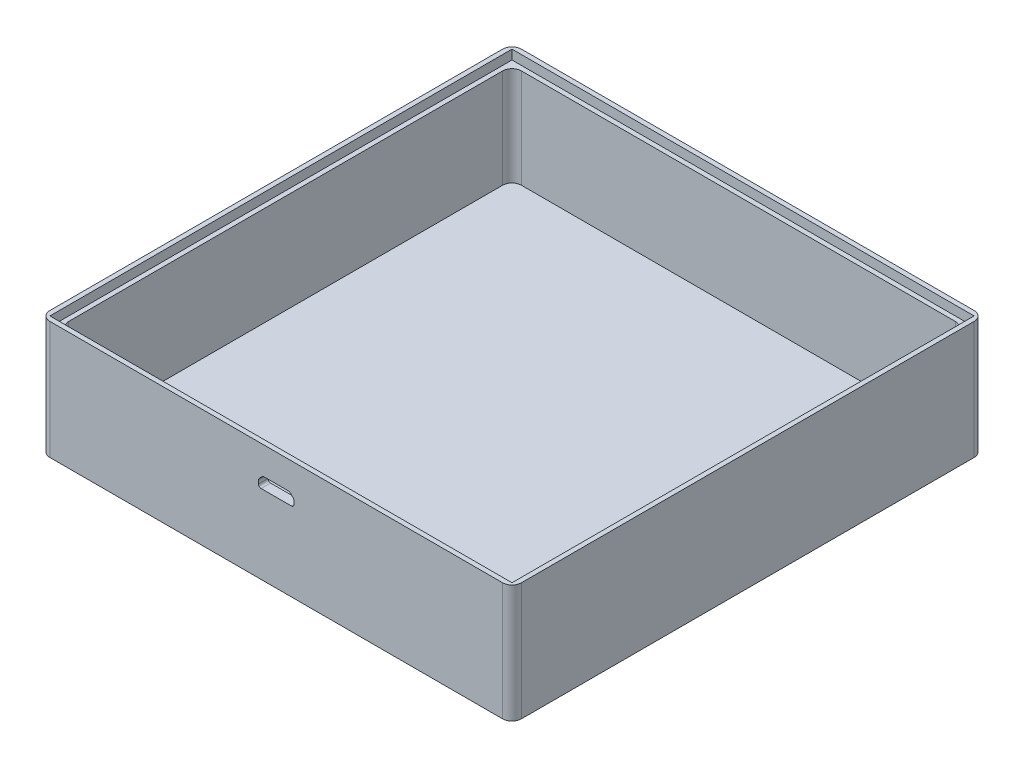
ISO-10303-21;
HEADER;
FILE_DESCRIPTION(('STEP AP214'),'2;1');
FILE_NAME('part.step','',(''),(''),'','','');
FILE_SCHEMA(('AUTOMOTIVE_DESIGN { 1 0 10303 214 1 1 1 1 }'));
ENDSEC;
DATA;
#1=APPLICATION_CONTEXT('core data for automotive mechanical design processes');
#2=APPLICATION_PROTOCOL_DEFINITION('international standard','automotive_design',2000,#1);
#3=PRODUCT_CONTEXT('',#1,'mechanical');
#4=PRODUCT('Part','Part','',(#3));
#5=PRODUCT_RELATED_PRODUCT_CATEGORY('part','',(#4));
#6=PRODUCT_DEFINITION_FORMATION('','',#4);
#7=PRODUCT_DEFINITION_CONTEXT('part definition',#1,'design');
#8=PRODUCT_DEFINITION('design','',#6,#7);
#9=PRODUCT_DEFINITION_SHAPE('','',#8);
#10=(LENGTH_UNIT() NAMED_UNIT(*) SI_UNIT(.MILLI.,.METRE.));
#11=(NAMED_UNIT(*) PLANE_ANGLE_UNIT() SI_UNIT($,.RADIAN.));
#12=(NAMED_UNIT(*) SI_UNIT($,.STERADIAN.) SOLID_ANGLE_UNIT());
#13=UNCERTAINTY_MEASURE_WITH_UNIT(LENGTH_MEASURE(1.E-05),#10,'distance_accuracy_value','');
#14=(GEOMETRIC_REPRESENTATION_CONTEXT(3) GLOBAL_UNCERTAINTY_ASSIGNED_CONTEXT((#13)) GLOBAL_UNIT_ASSIGNED_CONTEXT((#10,
#11,#12)) REPRESENTATION_CONTEXT('',''));
#15=CARTESIAN_POINT('',(0.,0.,0.));
#16=DIRECTION('',(0.,0.,1.));
#17=DIRECTION('',(1.,0.,0.));
#18=AXIS2_PLACEMENT_3D('',#15,#16,#17);
#19=CARTESIAN_POINT('',(0.,25.,50.));
#20=DIRECTION('',(0.,0.,-1.));
#21=DIRECTION('',(-1.,0.,0.));
#22=AXIS2_PLACEMENT_3D('',#19,#20,#21);
#23=PLANE('',#22);
#24=DIRECTION('',(0.,1.,0.));
#25=VECTOR('',#24,1.);
#26=CARTESIAN_POINT('',(3.75,0.,50.));
#27=LINE('',#26,#25);
#28=CARTESIAN_POINT('',(3.75,17.2550000000001,50.));
#29=VERTEX_POINT('',#28);
#30=CARTESIAN_POINT('',(3.75,18.001446611338,50.));
#31=VERTEX_POINT('',#30);
#32=EDGE_CURVE('E320',#29,#31,#27,.T.);
#33=ORIENTED_EDGE('',*,*,#32,.F.);
#34=CARTESIAN_POINT('',(3.20000000000001,17.255,50.));
#35=DIRECTION('',(0.,0.,1.));
#36=DIRECTION('',(1.,0.,0.));
#37=AXIS2_PLACEMENT_3D('',#34,#35,#36);
#38=CIRCLE('',#37,0.549999999999995);
#39=CARTESIAN_POINT('',(3.20000000000001,16.705,50.));
#40=VERTEX_POINT('',#39);
#41=EDGE_CURVE('E316',#29,#40,#38,.F.);
#42=ORIENTED_EDGE('',*,*,#41,.T.);
#43=DIRECTION('',(-1.,0.,0.));
#44=VECTOR('',#43,1.);
#45=CARTESIAN_POINT('',(0.,16.705,50.));
#46=LINE('',#45,#44);
#47=CARTESIAN_POINT('',(-3.20000000000001,16.705,50.));
#48=VERTEX_POINT('',#47);
#49=EDGE_CURVE('E355',#40,#48,#46,.T.);
#50=ORIENTED_EDGE('',*,*,#49,.T.);
#51=CARTESIAN_POINT('',(-3.20000000000001,17.255,50.));
#52=DIRECTION('',(0.,0.,1.));
#53=DIRECTION('',(1.,0.,0.));
#54=AXIS2_PLACEMENT_3D('',#51,#52,#53);
#55=CIRCLE('',#54,0.549999999999995);
#56=CARTESIAN_POINT('',(-3.75,17.2550000000001,50.));
#57=VERTEX_POINT('',#56);
#58=EDGE_CURVE('E351',#57,#48,#55,.T.);
#59=ORIENTED_EDGE('',*,*,#58,.F.);
#60=DIRECTION('',(0.,1.,0.));
#61=VECTOR('',#60,1.);
#62=CARTESIAN_POINT('',(-3.75,0.,50.));
#63=LINE('',#62,#61);
#64=CARTESIAN_POINT('',(-3.75,18.001446611338,50.));
#65=VERTEX_POINT('',#64);
#66=EDGE_CURVE('E347',#57,#65,#63,.T.);
#67=ORIENTED_EDGE('',*,*,#66,.T.);
#68=CARTESIAN_POINT('',(-3.2000000046621,18.001446611338,50.));
#69=DIRECTION('',(0.,0.,1.));
#70=DIRECTION('',(1.,0.,0.));
#71=AXIS2_PLACEMENT_3D('',#68,#69,#70);
#72=CIRCLE('',#71,0.549999995337901);
#73=CARTESIAN_POINT('',(-3.5889087296526,18.3903553390594,50.));
#74=VERTEX_POINT('',#73);
#75=EDGE_CURVE('E344',#74,#65,#72,.T.);
#76=ORIENTED_EDGE('',*,*,#75,.F.);
#77=DIRECTION('',(0.707106781186547,0.707106781186548,0.));
#78=VECTOR('',#77,1.);
#79=CARTESIAN_POINT('',(-10.989632034356,10.989632034356,50.));
#80=LINE('',#79,#78);
#81=CARTESIAN_POINT('',(-2.9853553390594,18.9939087296527,50.));
#82=VERTEX_POINT('',#81);
#83=EDGE_CURVE('E340',#74,#82,#80,.T.);
#84=ORIENTED_EDGE('',*,*,#83,.T.);
#85=CARTESIAN_POINT('',(-2.5964466094068,18.6050000000001,50.));
#86=DIRECTION('',(0.,0.,1.));
#87=DIRECTION('',(1.,0.,0.));
#88=AXIS2_PLACEMENT_3D('',#85,#86,#87);
#89=CIRCLE('',#88,0.549999999999997);
#90=CARTESIAN_POINT('',(-2.5964466094068,19.1550000000001,50.));
#91=VERTEX_POINT('',#90);
#92=EDGE_CURVE('E337',#91,#82,#89,.T.);
#93=ORIENTED_EDGE('',*,*,#92,.F.);
#94=DIRECTION('',(-1.,0.,0.));
#95=VECTOR('',#94,1.);
#96=CARTESIAN_POINT('',(0.,19.1550000000001,50.));
#97=LINE('',#96,#95);
#98=CARTESIAN_POINT('',(2.5964466094068,19.1550000000001,50.));
#99=VERTEX_POINT('',#98);
#100=EDGE_CURVE('E334',#99,#91,#97,.T.);
#101=ORIENTED_EDGE('',*,*,#100,.F.);
#102=CARTESIAN_POINT('',(2.5964466094068,18.6050000000001,50.));
#103=DIRECTION('',(0.,0.,1.));
#104=DIRECTION('',(1.,0.,0.));
#105=AXIS2_PLACEMENT_3D('',#102,#103,#104);
#106=CIRCLE('',#105,0.549999999999998);
#107=CARTESIAN_POINT('',(2.9853553390594,18.9939087296527,50.));
#108=VERTEX_POINT('',#107);
#109=EDGE_CURVE('E330',#99,#108,#106,.F.);
#110=ORIENTED_EDGE('',*,*,#109,.T.);
#111=DIRECTION('',(-0.707106781186547,0.707106781186548,0.));
#112=VECTOR('',#111,1.);
#113=CARTESIAN_POINT('',(10.989632034356,10.989632034356,50.));
#114=LINE('',#113,#112);
#115=CARTESIAN_POINT('',(3.5889087296526,18.3903553390594,50.));
#116=VERTEX_POINT('',#115);
#117=EDGE_CURVE('E327',#116,#108,#114,.T.);
#118=ORIENTED_EDGE('',*,*,#117,.F.);
#119=CARTESIAN_POINT('',(3.2000000046621,18.001446611338,50.));
#120=DIRECTION('',(0.,0.,1.));
#121=DIRECTION('',(1.,0.,0.));
#122=AXIS2_PLACEMENT_3D('',#119,#120,#121);
#123=CIRCLE('',#122,0.549999995337902);
#124=EDGE_CURVE('E323',#116,#31,#123,.F.);
#125=ORIENTED_EDGE('',*,*,#124,.T.);
#126=EDGE_LOOP('',(#33,#42,#50,#59,#67,#76,#84,#93,#101,#110,#118,#125));
#127=FACE_BOUND('',#126,.T.);
#128=DIRECTION('',(1.,0.,0.));
#129=VECTOR('',#128,1.);
#130=CARTESIAN_POINT('',(-50.,25.,50.));
#131=LINE('',#130,#129);
#132=CARTESIAN_POINT('',(-48.,25.,50.));
#133=VERTEX_POINT('',#132);
#134=CARTESIAN_POINT('',(48.,25.,50.));
#135=VERTEX_POINT('',#134);
#136=EDGE_CURVE('E423',#133,#135,#131,.T.);
#137=ORIENTED_EDGE('',*,*,#136,.F.);
#138=DIRECTION('',(0.,-1.,0.));
#139=VECTOR('',#138,1.);
#140=CARTESIAN_POINT('',(-48.,25.,50.));
#141=LINE('',#140,#139);
#142=CARTESIAN_POINT('',(-48.,0.,50.));
#143=VERTEX_POINT('',#142);
#144=EDGE_CURVE('E503',#133,#143,#141,.T.);
#145=ORIENTED_EDGE('',*,*,#144,.T.);
#146=DIRECTION('',(1.,0.,0.));
#147=VECTOR('',#146,1.);
#148=CARTESIAN_POINT('',(0.,0.,50.));
#149=LINE('',#148,#147);
#150=CARTESIAN_POINT('',(48.,0.,50.));
#151=VERTEX_POINT('',#150);
#152=EDGE_CURVE('E422',#143,#151,#149,.T.);
#153=ORIENTED_EDGE('',*,*,#152,.T.);
#154=DIRECTION('',(0.,-1.,0.));
#155=VECTOR('',#154,1.);
#156=CARTESIAN_POINT('',(48.,25.,50.));
#157=LINE('',#156,#155);
#158=EDGE_CURVE('E500',#151,#135,#157,.F.);
#159=ORIENTED_EDGE('',*,*,#158,.T.);
#160=EDGE_LOOP('',(#137,#145,#153,#159));
#161=FACE_BOUND('',#160,.T.);
#162=ADVANCED_FACE('F41',(#127,#161),#23,.F.);
#163=CARTESIAN_POINT('',(50.,25.,50.));
#164=DIRECTION('',(-1.,0.,0.));
#165=DIRECTION('',(0.,0.,1.));
#166=AXIS2_PLACEMENT_3D('',#163,#164,#165);
#167=PLANE('',#166);
#168=DIRECTION('',(0.,0.,-1.));
#169=VECTOR('',#168,1.);
#170=CARTESIAN_POINT('',(50.,0.,50.));
#171=LINE('',#170,#169);
#172=CARTESIAN_POINT('',(50.,0.,48.));
#173=VERTEX_POINT('',#172);
#174=CARTESIAN_POINT('',(50.,0.,-48.));
#175=VERTEX_POINT('',#174);
#176=EDGE_CURVE('E444',#173,#175,#171,.T.);
#177=ORIENTED_EDGE('',*,*,#176,.T.);
#178=DIRECTION('',(0.,-1.,0.));
#179=VECTOR('',#178,1.);
#180=CARTESIAN_POINT('',(50.,25.,-48.));
#181=LINE('',#180,#179);
#182=CARTESIAN_POINT('',(50.,25.,-48.));
#183=VERTEX_POINT('',#182);
#184=EDGE_CURVE('E549',#175,#183,#181,.F.);
#185=ORIENTED_EDGE('',*,*,#184,.T.);
#186=DIRECTION('',(0.,0.,-1.));
#187=VECTOR('',#186,1.);
#188=CARTESIAN_POINT('',(50.,25.,50.));
#189=LINE('',#188,#187);
#190=CARTESIAN_POINT('',(50.,25.,48.));
#191=VERTEX_POINT('',#190);
#192=EDGE_CURVE('E427',#191,#183,#189,.T.);
#193=ORIENTED_EDGE('',*,*,#192,.F.);
#194=DIRECTION('',(0.,-1.,0.));
#195=VECTOR('',#194,1.);
#196=CARTESIAN_POINT('',(50.,25.,48.));
#197=LINE('',#196,#195);
#198=EDGE_CURVE('E545',#191,#173,#197,.T.);
#199=ORIENTED_EDGE('',*,*,#198,.T.);
#200=EDGE_LOOP('',(#177,#185,#193,#199));
#201=FACE_BOUND('',#200,.T.);
#202=ADVANCED_FACE('F639',(#201),#167,.F.);
#203=CARTESIAN_POINT('',(-50.,25.,-50.));
#204=DIRECTION('',(0.,0.,1.));
#205=DIRECTION('',(1.,0.,0.));
#206=AXIS2_PLACEMENT_3D('',#203,#204,#205);
#207=PLANE('',#206);
#208=DIRECTION('',(-1.,0.,0.));
#209=VECTOR('',#208,1.);
#210=CARTESIAN_POINT('',(-50.,0.,-50.));
#211=LINE('',#210,#209);
#212=CARTESIAN_POINT('',(48.,0.,-50.));
#213=VERTEX_POINT('',#212);
#214=CARTESIAN_POINT('',(-48.,0.,-50.));
#215=VERTEX_POINT('',#214);
#216=EDGE_CURVE('E448',#213,#215,#211,.T.);
#217=ORIENTED_EDGE('',*,*,#216,.T.);
#218=DIRECTION('',(0.,-1.,0.));
#219=VECTOR('',#218,1.);
#220=CARTESIAN_POINT('',(-48.,25.,-50.));
#221=LINE('',#220,#219);
#222=CARTESIAN_POINT('',(-48.,25.,-50.));
#223=VERTEX_POINT('',#222);
#224=EDGE_CURVE('E542',#215,#223,#221,.F.);
#225=ORIENTED_EDGE('',*,*,#224,.T.);
#226=DIRECTION('',(-1.,0.,0.));
#227=VECTOR('',#226,1.);
#228=CARTESIAN_POINT('',(-50.,25.,-50.));
#229=LINE('',#228,#227);
#230=CARTESIAN_POINT('',(48.,25.,-50.));
#231=VERTEX_POINT('',#230);
#232=EDGE_CURVE('E432',#231,#223,#229,.T.);
#233=ORIENTED_EDGE('',*,*,#232,.F.);
#234=DIRECTION('',(0.,-1.,0.));
#235=VECTOR('',#234,1.);
#236=CARTESIAN_POINT('',(48.,25.,-50.));
#237=LINE('',#236,#235);
#238=EDGE_CURVE('E538',#231,#213,#237,.T.);
#239=ORIENTED_EDGE('',*,*,#238,.T.);
#240=EDGE_LOOP('',(#217,#225,#233,#239));
#241=FACE_BOUND('',#240,.T.);
#242=ADVANCED_FACE('F645',(#241),#207,.F.);
#243=CARTESIAN_POINT('',(-50.,25.,-50.));
#244=DIRECTION('',(1.,0.,0.));
#245=DIRECTION('',(0.,0.,-1.));
#246=AXIS2_PLACEMENT_3D('',#243,#244,#245);
#247=PLANE('',#246);
#248=DIRECTION('',(0.,0.,1.));
#249=VECTOR('',#248,1.);
#250=CARTESIAN_POINT('',(-50.,0.,-50.));
#251=LINE('',#250,#249);
#252=CARTESIAN_POINT('',(-50.,0.,-48.));
#253=VERTEX_POINT('',#252);
#254=CARTESIAN_POINT('',(-50.,0.,48.));
#255=VERTEX_POINT('',#254);
#256=EDGE_CURVE('E428',#253,#255,#251,.T.);
#257=ORIENTED_EDGE('',*,*,#256,.T.);
#258=DIRECTION('',(0.,-1.,0.));
#259=VECTOR('',#258,1.);
#260=CARTESIAN_POINT('',(-50.,25.,48.));
#261=LINE('',#260,#259);
#262=CARTESIAN_POINT('',(-50.,25.,48.));
#263=VERTEX_POINT('',#262);
#264=EDGE_CURVE('E523',#255,#263,#261,.F.);
#265=ORIENTED_EDGE('',*,*,#264,.T.);
#266=DIRECTION('',(0.,0.,1.));
#267=VECTOR('',#266,1.);
#268=CARTESIAN_POINT('',(-50.,25.,-50.));
#269=LINE('',#268,#267);
#270=CARTESIAN_POINT('',(-50.,25.,-48.));
#271=VERTEX_POINT('',#270);
#272=EDGE_CURVE('E436',#271,#263,#269,.T.);
#273=ORIENTED_EDGE('',*,*,#272,.F.);
#274=DIRECTION('',(0.,-1.,0.));
#275=VECTOR('',#274,1.);
#276=CARTESIAN_POINT('',(-50.,25.,-48.));
#277=LINE('',#276,#275);
#278=EDGE_CURVE('E519',#271,#253,#277,.T.);
#279=ORIENTED_EDGE('',*,*,#278,.T.);
#280=EDGE_LOOP('',(#257,#265,#273,#279));
#281=FACE_BOUND('',#280,.T.);
#282=ADVANCED_FACE('F688',(#281),#247,.F.);
#283=CARTESIAN_POINT('',(0.,25.,0.));
#284=DIRECTION('',(0.,1.,0.));
#285=DIRECTION('',(0.,0.,1.));
#286=AXIS2_PLACEMENT_3D('',#283,#284,#285);
#287=PLANE('',#286);
#288=DIRECTION('',(1.,0.,0.));
#289=VECTOR('',#288,1.);
#290=CARTESIAN_POINT('',(49.,25.,49.));
#291=LINE('',#290,#289);
#292=CARTESIAN_POINT('',(-49.,25.,49.));
#293=VERTEX_POINT('',#292);
#294=CARTESIAN_POINT('',(49.,25.,49.));
#295=VERTEX_POINT('',#294);
#296=EDGE_CURVE('E258',#293,#295,#291,.T.);
#297=ORIENTED_EDGE('',*,*,#296,.F.);
#298=DIRECTION('',(0.,0.,1.));
#299=VECTOR('',#298,1.);
#300=CARTESIAN_POINT('',(-49.,25.,49.));
#301=LINE('',#300,#299);
#302=CARTESIAN_POINT('',(-49.,25.,-49.));
#303=VERTEX_POINT('',#302);
#304=EDGE_CURVE('E278',#303,#293,#301,.T.);
#305=ORIENTED_EDGE('',*,*,#304,.F.);
#306=DIRECTION('',(-1.,0.,0.));
#307=VECTOR('',#306,1.);
#308=CARTESIAN_POINT('',(-49.,25.,-49.));
#309=LINE('',#308,#307);
#310=CARTESIAN_POINT('',(49.,25.,-49.));
#311=VERTEX_POINT('',#310);
#312=EDGE_CURVE('E282',#311,#303,#309,.T.);
#313=ORIENTED_EDGE('',*,*,#312,.F.);
#314=DIRECTION('',(0.,0.,-1.));
#315=VECTOR('',#314,1.);
#316=CARTESIAN_POINT('',(49.,25.,-49.));
#317=LINE('',#316,#315);
#318=EDGE_CURVE('E291',#295,#311,#317,.T.);
#319=ORIENTED_EDGE('',*,*,#318,.F.);
#320=EDGE_LOOP('',(#297,#305,#313,#319));
#321=FACE_BOUND('',#320,.T.);
#322=ORIENTED_EDGE('',*,*,#272,.T.);
#323=CARTESIAN_POINT('',(-48.,25.,48.));
#324=DIRECTION('',(0.,1.,0.));
#325=DIRECTION('',(0.,0.,1.));
#326=AXIS2_PLACEMENT_3D('',#323,#324,#325);
#327=CIRCLE('',#326,2.);
#328=EDGE_CURVE('E535',#263,#133,#327,.T.);
#329=ORIENTED_EDGE('',*,*,#328,.T.);
#330=ORIENTED_EDGE('',*,*,#136,.T.);
#331=CARTESIAN_POINT('',(48.,25.,48.));
#332=DIRECTION('',(0.,1.,0.));
#333=DIRECTION('',(0.,0.,1.));
#334=AXIS2_PLACEMENT_3D('',#331,#332,#333);
#335=CIRCLE('',#334,2.);
#336=EDGE_CURVE('E526',#135,#191,#335,.T.);
#337=ORIENTED_EDGE('',*,*,#336,.T.);
#338=ORIENTED_EDGE('',*,*,#192,.T.);
#339=CARTESIAN_POINT('',(48.,25.,-48.));
#340=DIRECTION('',(0.,1.,0.));
#341=DIRECTION('',(0.,0.,1.));
#342=AXIS2_PLACEMENT_3D('',#339,#340,#341);
#343=CIRCLE('',#342,2.);
#344=EDGE_CURVE('E529',#183,#231,#343,.T.);
#345=ORIENTED_EDGE('',*,*,#344,.T.);
#346=ORIENTED_EDGE('',*,*,#232,.T.);
#347=CARTESIAN_POINT('',(-48.,25.,-48.));
#348=DIRECTION('',(0.,1.,0.));
#349=DIRECTION('',(0.,0.,1.));
#350=AXIS2_PLACEMENT_3D('',#347,#348,#349);
#351=CIRCLE('',#350,2.);
#352=EDGE_CURVE('E532',#223,#271,#351,.T.);
#353=ORIENTED_EDGE('',*,*,#352,.T.);
#354=EDGE_LOOP('',(#322,#329,#330,#337,#338,#345,#346,#353));
#355=FACE_BOUND('',#354,.T.);
#356=ADVANCED_FACE('F673',(#321,#355),#287,.T.);
#357=CARTESIAN_POINT('',(0.,0.,0.));
#358=DIRECTION('',(0.,1.,0.));
#359=DIRECTION('',(0.,0.,1.));
#360=AXIS2_PLACEMENT_3D('',#357,#358,#359);
#361=PLANE('',#360);
#362=ORIENTED_EDGE('',*,*,#152,.F.);
#363=CARTESIAN_POINT('',(-48.,0.,48.));
#364=DIRECTION('',(0.,1.,0.));
#365=DIRECTION('',(0.,0.,1.));
#366=AXIS2_PLACEMENT_3D('',#363,#364,#365);
#367=CIRCLE('',#366,2.);
#368=EDGE_CURVE('E516',#143,#255,#367,.F.);
#369=ORIENTED_EDGE('',*,*,#368,.T.);
#370=ORIENTED_EDGE('',*,*,#256,.F.);
#371=CARTESIAN_POINT('',(-48.,0.,-48.));
#372=DIRECTION('',(0.,1.,0.));
#373=DIRECTION('',(0.,0.,1.));
#374=AXIS2_PLACEMENT_3D('',#371,#372,#373);
#375=CIRCLE('',#374,2.);
#376=EDGE_CURVE('E513',#253,#215,#375,.F.);
#377=ORIENTED_EDGE('',*,*,#376,.T.);
#378=ORIENTED_EDGE('',*,*,#216,.F.);
#379=CARTESIAN_POINT('',(48.,0.,-48.));
#380=DIRECTION('',(0.,1.,0.));
#381=DIRECTION('',(0.,0.,1.));
#382=AXIS2_PLACEMENT_3D('',#379,#380,#381);
#383=CIRCLE('',#382,2.);
#384=EDGE_CURVE('E510',#213,#175,#383,.F.);
#385=ORIENTED_EDGE('',*,*,#384,.T.);
#386=ORIENTED_EDGE('',*,*,#176,.F.);
#387=CARTESIAN_POINT('',(48.,0.,48.));
#388=DIRECTION('',(0.,1.,0.));
#389=DIRECTION('',(0.,0.,1.));
#390=AXIS2_PLACEMENT_3D('',#387,#388,#389);
#391=CIRCLE('',#390,2.);
#392=EDGE_CURVE('E507',#173,#151,#391,.F.);
#393=ORIENTED_EDGE('',*,*,#392,.T.);
#394=EDGE_LOOP('',(#362,#369,#370,#377,#378,#385,#386,#393));
#395=FACE_BOUND('',#394,.T.);
#396=ADVANCED_FACE('F694',(#395),#361,.F.);
#397=CARTESIAN_POINT('',(0.,25.,48.));
#398=DIRECTION('',(0.,0.,-1.));
#399=DIRECTION('',(-1.,0.,0.));
#400=AXIS2_PLACEMENT_3D('',#397,#398,#399);
#401=PLANE('',#400);
#402=DIRECTION('',(-1.,0.,0.));
#403=VECTOR('',#402,1.);
#404=CARTESIAN_POINT('',(0.,23.,48.));
#405=LINE('',#404,#403);
#406=CARTESIAN_POINT('',(46.,23.,48.));
#407=VERTEX_POINT('',#406);
#408=CARTESIAN_POINT('',(-46.,23.,48.));
#409=VERTEX_POINT('',#408);
#410=EDGE_CURVE('E313',#407,#409,#405,.T.);
#411=ORIENTED_EDGE('',*,*,#410,.F.);
#412=DIRECTION('',(0.,-1.,0.));
#413=VECTOR('',#412,1.);
#414=CARTESIAN_POINT('',(46.,2.,48.));
#415=LINE('',#414,#413);
#416=CARTESIAN_POINT('',(46.,2.,48.));
#417=VERTEX_POINT('',#416);
#418=EDGE_CURVE('E555',#407,#417,#415,.T.);
#419=ORIENTED_EDGE('',*,*,#418,.T.);
#420=DIRECTION('',(1.,0.,0.));
#421=VECTOR('',#420,1.);
#422=CARTESIAN_POINT('',(0.,2.,48.));
#423=LINE('',#422,#421);
#424=CARTESIAN_POINT('',(-46.,2.,48.));
#425=VERTEX_POINT('',#424);
#426=EDGE_CURVE('E406',#425,#417,#423,.T.);
#427=ORIENTED_EDGE('',*,*,#426,.F.);
#428=DIRECTION('',(0.,-1.,0.));
#429=VECTOR('',#428,1.);
#430=CARTESIAN_POINT('',(-46.,23.,48.));
#431=LINE('',#430,#429);
#432=EDGE_CURVE('E552',#425,#409,#431,.F.);
#433=ORIENTED_EDGE('',*,*,#432,.T.);
#434=EDGE_LOOP('',(#411,#419,#427,#433));
#435=FACE_BOUND('',#434,.T.);
#436=CARTESIAN_POINT('',(3.20000000000001,17.255,48.));
#437=DIRECTION('',(0.,0.,-1.));
#438=DIRECTION('',(-1.,0.,0.));
#439=AXIS2_PLACEMENT_3D('',#436,#437,#438);
#440=CIRCLE('',#439,0.549999999999995);
#441=CARTESIAN_POINT('',(3.75,17.2550000000001,48.));
#442=VERTEX_POINT('',#441);
#443=CARTESIAN_POINT('',(3.20000000000001,16.705,48.));
#444=VERTEX_POINT('',#443);
#445=EDGE_CURVE('E493',#442,#444,#440,.T.);
#446=ORIENTED_EDGE('',*,*,#445,.F.);
#447=DIRECTION('',(0.,1.,0.));
#448=VECTOR('',#447,1.);
#449=CARTESIAN_POINT('',(3.75,25.,48.));
#450=LINE('',#449,#448);
#451=CARTESIAN_POINT('',(3.75,18.001446611338,48.));
#452=VERTEX_POINT('',#451);
#453=EDGE_CURVE('E489',#442,#452,#450,.T.);
#454=ORIENTED_EDGE('',*,*,#453,.T.);
#455=CARTESIAN_POINT('',(3.2000000046621,18.001446611338,48.));
#456=DIRECTION('',(0.,0.,-1.));
#457=DIRECTION('',(-1.,0.,0.));
#458=AXIS2_PLACEMENT_3D('',#455,#456,#457);
#459=CIRCLE('',#458,0.549999995337902);
#460=CARTESIAN_POINT('',(3.5889087296526,18.3903553390594,48.));
#461=VERTEX_POINT('',#460);
#462=EDGE_CURVE('E486',#461,#452,#459,.T.);
#463=ORIENTED_EDGE('',*,*,#462,.F.);
#464=DIRECTION('',(-0.707106781186547,0.707106781186548,0.));
#465=VECTOR('',#464,1.);
#466=CARTESIAN_POINT('',(-1.51036796564397,23.489632034356,48.));
#467=LINE('',#466,#465);
#468=CARTESIAN_POINT('',(2.9853553390594,18.9939087296527,48.));
#469=VERTEX_POINT('',#468);
#470=EDGE_CURVE('E482',#461,#469,#467,.T.);
#471=ORIENTED_EDGE('',*,*,#470,.T.);
#472=CARTESIAN_POINT('',(2.5964466094068,18.6050000000001,48.));
#473=DIRECTION('',(0.,0.,-1.));
#474=DIRECTION('',(-1.,0.,0.));
#475=AXIS2_PLACEMENT_3D('',#472,#473,#474);
#476=CIRCLE('',#475,0.549999999999998);
#477=CARTESIAN_POINT('',(2.5964466094068,19.1550000000001,48.));
#478=VERTEX_POINT('',#477);
#479=EDGE_CURVE('E479',#478,#469,#476,.T.);
#480=ORIENTED_EDGE('',*,*,#479,.F.);
#481=DIRECTION('',(-1.,0.,0.));
#482=VECTOR('',#481,1.);
#483=CARTESIAN_POINT('',(0.,19.1550000000001,48.));
#484=LINE('',#483,#482);
#485=CARTESIAN_POINT('',(-2.5964466094068,19.1550000000001,48.));
#486=VERTEX_POINT('',#485);
#487=EDGE_CURVE('E475',#478,#486,#484,.T.);
#488=ORIENTED_EDGE('',*,*,#487,.T.);
#489=CARTESIAN_POINT('',(-2.5964466094068,18.6050000000001,48.));
#490=DIRECTION('',(0.,0.,-1.));
#491=DIRECTION('',(-1.,0.,0.));
#492=AXIS2_PLACEMENT_3D('',#489,#490,#491);
#493=CIRCLE('',#492,0.549999999999997);
#494=CARTESIAN_POINT('',(-2.9853553390594,18.9939087296527,48.));
#495=VERTEX_POINT('',#494);
#496=EDGE_CURVE('E471',#486,#495,#493,.F.);
#497=ORIENTED_EDGE('',*,*,#496,.T.);
#498=DIRECTION('',(0.707106781186547,0.707106781186548,0.));
#499=VECTOR('',#498,1.);
#500=CARTESIAN_POINT('',(1.51036796564398,23.489632034356,48.));
#501=LINE('',#500,#499);
#502=CARTESIAN_POINT('',(-3.5889087296526,18.3903553390594,48.));
#503=VERTEX_POINT('',#502);
#504=EDGE_CURVE('E468',#503,#495,#501,.T.);
#505=ORIENTED_EDGE('',*,*,#504,.F.);
#506=CARTESIAN_POINT('',(-3.2000000046621,18.001446611338,48.));
#507=DIRECTION('',(0.,0.,-1.));
#508=DIRECTION('',(-1.,0.,0.));
#509=AXIS2_PLACEMENT_3D('',#506,#507,#508);
#510=CIRCLE('',#509,0.549999995337901);
#511=CARTESIAN_POINT('',(-3.75,18.001446611338,48.));
#512=VERTEX_POINT('',#511);
#513=EDGE_CURVE('E464',#503,#512,#510,.F.);
#514=ORIENTED_EDGE('',*,*,#513,.T.);
#515=DIRECTION('',(0.,1.,0.));
#516=VECTOR('',#515,1.);
#517=CARTESIAN_POINT('',(-3.75,25.,48.));
#518=LINE('',#517,#516);
#519=CARTESIAN_POINT('',(-3.75,17.2550000000001,48.));
#520=VERTEX_POINT('',#519);
#521=EDGE_CURVE('E461',#520,#512,#518,.T.);
#522=ORIENTED_EDGE('',*,*,#521,.F.);
#523=CARTESIAN_POINT('',(-3.20000000000001,17.255,48.));
#524=DIRECTION('',(0.,0.,-1.));
#525=DIRECTION('',(-1.,0.,0.));
#526=AXIS2_PLACEMENT_3D('',#523,#524,#525);
#527=CIRCLE('',#526,0.549999999999995);
#528=CARTESIAN_POINT('',(-3.20000000000001,16.705,48.));
#529=VERTEX_POINT('',#528);
#530=EDGE_CURVE('E457',#520,#529,#527,.F.);
#531=ORIENTED_EDGE('',*,*,#530,.T.);
#532=DIRECTION('',(-1.,0.,0.));
#533=VECTOR('',#532,1.);
#534=CARTESIAN_POINT('',(0.,16.705,48.));
#535=LINE('',#534,#533);
#536=EDGE_CURVE('E440',#444,#529,#535,.T.);
#537=ORIENTED_EDGE('',*,*,#536,.F.);
#538=EDGE_LOOP('',(#446,#454,#463,#471,#480,#488,#497,#505,#514,#522,#531,#537));
#539=FACE_BOUND('',#538,.T.);
#540=ADVANCED_FACE('F616',(#435,#539),#401,.T.);
#541=CARTESIAN_POINT('',(48.,25.,50.));
#542=DIRECTION('',(-1.,0.,0.));
#543=DIRECTION('',(0.,0.,1.));
#544=AXIS2_PLACEMENT_3D('',#541,#542,#543);
#545=PLANE('',#544);
#546=DIRECTION('',(0.,0.,-1.));
#547=VECTOR('',#546,1.);
#548=CARTESIAN_POINT('',(48.,2.,50.));
#549=LINE('',#548,#547);
#550=CARTESIAN_POINT('',(48.,2.,46.));
#551=VERTEX_POINT('',#550);
#552=CARTESIAN_POINT('',(48.,2.,-46.));
#553=VERTEX_POINT('',#552);
#554=EDGE_CURVE('E410',#551,#553,#549,.T.);
#555=ORIENTED_EDGE('',*,*,#554,.F.);
#556=DIRECTION('',(0.,-1.,0.));
#557=VECTOR('',#556,1.);
#558=CARTESIAN_POINT('',(48.,23.,46.));
#559=LINE('',#558,#557);
#560=CARTESIAN_POINT('',(48.,23.,46.));
#561=VERTEX_POINT('',#560);
#562=EDGE_CURVE('E575',#551,#561,#559,.F.);
#563=ORIENTED_EDGE('',*,*,#562,.T.);
#564=DIRECTION('',(0.,0.,1.));
#565=VECTOR('',#564,1.);
#566=CARTESIAN_POINT('',(48.,23.,50.));
#567=LINE('',#566,#565);
#568=CARTESIAN_POINT('',(48.,23.,-46.));
#569=VERTEX_POINT('',#568);
#570=EDGE_CURVE('E309',#569,#561,#567,.T.);
#571=ORIENTED_EDGE('',*,*,#570,.F.);
#572=DIRECTION('',(0.,-1.,0.));
#573=VECTOR('',#572,1.);
#574=CARTESIAN_POINT('',(48.,2.,-46.));
#575=LINE('',#574,#573);
#576=EDGE_CURVE('E571',#569,#553,#575,.T.);
#577=ORIENTED_EDGE('',*,*,#576,.T.);
#578=EDGE_LOOP('',(#555,#563,#571,#577));
#579=FACE_BOUND('',#578,.T.);
#580=ADVANCED_FACE('F625',(#579),#545,.T.);
#581=CARTESIAN_POINT('',(-50.,25.,-48.));
#582=DIRECTION('',(0.,0.,1.));
#583=DIRECTION('',(1.,0.,0.));
#584=AXIS2_PLACEMENT_3D('',#581,#582,#583);
#585=PLANE('',#584);
#586=DIRECTION('',(-1.,0.,0.));
#587=VECTOR('',#586,1.);
#588=CARTESIAN_POINT('',(-50.,2.,-48.));
#589=LINE('',#588,#587);
#590=CARTESIAN_POINT('',(46.,2.,-48.));
#591=VERTEX_POINT('',#590);
#592=CARTESIAN_POINT('',(-46.,2.,-48.));
#593=VERTEX_POINT('',#592);
#594=EDGE_CURVE('E414',#591,#593,#589,.T.);
#595=ORIENTED_EDGE('',*,*,#594,.F.);
#596=DIRECTION('',(0.,-1.,0.));
#597=VECTOR('',#596,1.);
#598=CARTESIAN_POINT('',(46.,23.,-48.));
#599=LINE('',#598,#597);
#600=CARTESIAN_POINT('',(46.,23.,-48.));
#601=VERTEX_POINT('',#600);
#602=EDGE_CURVE('E582',#591,#601,#599,.F.);
#603=ORIENTED_EDGE('',*,*,#602,.T.);
#604=DIRECTION('',(1.,0.,0.));
#605=VECTOR('',#604,1.);
#606=CARTESIAN_POINT('',(-50.,23.,-48.));
#607=LINE('',#606,#605);
#608=CARTESIAN_POINT('',(-46.,23.,-48.));
#609=VERTEX_POINT('',#608);
#610=EDGE_CURVE('E300',#609,#601,#607,.T.);
#611=ORIENTED_EDGE('',*,*,#610,.F.);
#612=DIRECTION('',(0.,-1.,0.));
#613=VECTOR('',#612,1.);
#614=CARTESIAN_POINT('',(-46.,2.,-48.));
#615=LINE('',#614,#613);
#616=EDGE_CURVE('E578',#609,#593,#615,.T.);
#617=ORIENTED_EDGE('',*,*,#616,.T.);
#618=EDGE_LOOP('',(#595,#603,#611,#617));
#619=FACE_BOUND('',#618,.T.);
#620=ADVANCED_FACE('F604',(#619),#585,.T.);
#621=CARTESIAN_POINT('',(-48.,25.,-50.));
#622=DIRECTION('',(1.,0.,0.));
#623=DIRECTION('',(0.,0.,-1.));
#624=AXIS2_PLACEMENT_3D('',#621,#622,#623);
#625=PLANE('',#624);
#626=DIRECTION('',(0.,0.,1.));
#627=VECTOR('',#626,1.);
#628=CARTESIAN_POINT('',(-48.,2.,-50.));
#629=LINE('',#628,#627);
#630=CARTESIAN_POINT('',(-48.,2.,-46.));
#631=VERTEX_POINT('',#630);
#632=CARTESIAN_POINT('',(-48.,2.,46.));
#633=VERTEX_POINT('',#632);
#634=EDGE_CURVE('E418',#631,#633,#629,.T.);
#635=ORIENTED_EDGE('',*,*,#634,.F.);
#636=DIRECTION('',(0.,-1.,0.));
#637=VECTOR('',#636,1.);
#638=CARTESIAN_POINT('',(-48.,23.,-46.));
#639=LINE('',#638,#637);
#640=CARTESIAN_POINT('',(-48.,23.,-46.));
#641=VERTEX_POINT('',#640);
#642=EDGE_CURVE('E57',#631,#641,#639,.F.);
#643=ORIENTED_EDGE('',*,*,#642,.T.);
#644=DIRECTION('',(0.,0.,-1.));
#645=VECTOR('',#644,1.);
#646=CARTESIAN_POINT('',(-48.,23.,-50.));
#647=LINE('',#646,#645);
#648=CARTESIAN_POINT('',(-48.,23.,46.));
#649=VERTEX_POINT('',#648);
#650=EDGE_CURVE('E497',#649,#641,#647,.T.);
#651=ORIENTED_EDGE('',*,*,#650,.F.);
#652=DIRECTION('',(0.,-1.,0.));
#653=VECTOR('',#652,1.);
#654=CARTESIAN_POINT('',(-48.,2.,46.));
#655=LINE('',#654,#653);
#656=EDGE_CURVE('E585',#649,#633,#655,.T.);
#657=ORIENTED_EDGE('',*,*,#656,.T.);
#658=EDGE_LOOP('',(#635,#643,#651,#657));
#659=FACE_BOUND('',#658,.T.);
#660=ADVANCED_FACE('F609',(#659),#625,.T.);
#661=CARTESIAN_POINT('',(0.,2.,0.));
#662=DIRECTION('',(0.,1.,0.));
#663=DIRECTION('',(0.,0.,1.));
#664=AXIS2_PLACEMENT_3D('',#661,#662,#663);
#665=PLANE('',#664);
#666=ORIENTED_EDGE('',*,*,#426,.T.);
#667=CARTESIAN_POINT('',(46.,2.,46.));
#668=DIRECTION('',(0.,1.,0.));
#669=DIRECTION('',(0.,0.,1.));
#670=AXIS2_PLACEMENT_3D('',#667,#668,#669);
#671=CIRCLE('',#670,2.);
#672=EDGE_CURVE('E568',#417,#551,#671,.T.);
#673=ORIENTED_EDGE('',*,*,#672,.T.);
#674=ORIENTED_EDGE('',*,*,#554,.T.);
#675=CARTESIAN_POINT('',(46.,2.,-46.));
#676=DIRECTION('',(0.,1.,0.));
#677=DIRECTION('',(0.,0.,1.));
#678=AXIS2_PLACEMENT_3D('',#675,#676,#677);
#679=CIRCLE('',#678,2.);
#680=EDGE_CURVE('E565',#553,#591,#679,.T.);
#681=ORIENTED_EDGE('',*,*,#680,.T.);
#682=ORIENTED_EDGE('',*,*,#594,.T.);
#683=CARTESIAN_POINT('',(-46.,2.,-46.));
#684=DIRECTION('',(0.,1.,0.));
#685=DIRECTION('',(0.,0.,1.));
#686=AXIS2_PLACEMENT_3D('',#683,#684,#685);
#687=CIRCLE('',#686,2.);
#688=EDGE_CURVE('E562',#593,#631,#687,.T.);
#689=ORIENTED_EDGE('',*,*,#688,.T.);
#690=ORIENTED_EDGE('',*,*,#634,.T.);
#691=CARTESIAN_POINT('',(-46.,2.,46.));
#692=DIRECTION('',(0.,1.,0.));
#693=DIRECTION('',(0.,0.,1.));
#694=AXIS2_PLACEMENT_3D('',#691,#692,#693);
#695=CIRCLE('',#694,2.);
#696=EDGE_CURVE('E559',#633,#425,#695,.T.);
#697=ORIENTED_EDGE('',*,*,#696,.T.);
#698=EDGE_LOOP('',(#666,#673,#674,#681,#682,#689,#690,#697));
#699=FACE_BOUND('',#698,.T.);
#700=ADVANCED_FACE('F608',(#699),#665,.T.);
#701=CARTESIAN_POINT('',(3.20000000000001,17.255,50.));
#702=DIRECTION('',(0.,0.,-1.));
#703=DIRECTION('',(-1.,0.,0.));
#704=AXIS2_PLACEMENT_3D('',#701,#702,#703);
#705=CYLINDRICAL_SURFACE('',#704,0.549999999999995);
#706=ORIENTED_EDGE('',*,*,#445,.T.);
#707=DIRECTION('',(0.,0.,-1.));
#708=VECTOR('',#707,1.);
#709=CARTESIAN_POINT('',(3.20000000000001,16.705,50.));
#710=LINE('',#709,#708);
#711=EDGE_CURVE('E359',#40,#444,#710,.T.);
#712=ORIENTED_EDGE('',*,*,#711,.F.);
#713=ORIENTED_EDGE('',*,*,#41,.F.);
#714=DIRECTION('',(0.,0.,-1.));
#715=VECTOR('',#714,1.);
#716=CARTESIAN_POINT('',(3.75,17.2550000000001,50.));
#717=LINE('',#716,#715);
#718=EDGE_CURVE('E402',#29,#442,#717,.T.);
#719=ORIENTED_EDGE('',*,*,#718,.T.);
#720=EDGE_LOOP('',(#706,#712,#713,#719));
#721=FACE_BOUND('',#720,.T.);
#722=ADVANCED_FACE('F790',(#721),#705,.F.);
#723=CARTESIAN_POINT('',(3.75,0.,50.));
#724=DIRECTION('',(-1.,0.,0.));
#725=DIRECTION('',(0.,0.,1.));
#726=AXIS2_PLACEMENT_3D('',#723,#724,#725);
#727=PLANE('',#726);
#728=ORIENTED_EDGE('',*,*,#718,.F.);
#729=ORIENTED_EDGE('',*,*,#32,.T.);
#730=DIRECTION('',(0.,0.,-1.));
#731=VECTOR('',#730,1.);
#732=CARTESIAN_POINT('',(3.75,18.001446611338,50.));
#733=LINE('',#732,#731);
#734=EDGE_CURVE('E398',#31,#452,#733,.T.);
#735=ORIENTED_EDGE('',*,*,#734,.T.);
#736=ORIENTED_EDGE('',*,*,#453,.F.);
#737=EDGE_LOOP('',(#728,#729,#735,#736));
#738=FACE_BOUND('',#737,.T.);
#739=ADVANCED_FACE('F928',(#738),#727,.T.);
#740=CARTESIAN_POINT('',(3.2000000046621,18.001446611338,50.));
#741=DIRECTION('',(0.,0.,-1.));
#742=DIRECTION('',(-1.,0.,0.));
#743=AXIS2_PLACEMENT_3D('',#740,#741,#742);
#744=CYLINDRICAL_SURFACE('',#743,0.549999995337902);
#745=ORIENTED_EDGE('',*,*,#462,.T.);
#746=ORIENTED_EDGE('',*,*,#734,.F.);
#747=ORIENTED_EDGE('',*,*,#124,.F.);
#748=DIRECTION('',(0.,0.,-1.));
#749=VECTOR('',#748,1.);
#750=CARTESIAN_POINT('',(3.5889087296526,18.3903553390594,50.));
#751=LINE('',#750,#749);
#752=EDGE_CURVE('E394',#116,#461,#751,.T.);
#753=ORIENTED_EDGE('',*,*,#752,.T.);
#754=EDGE_LOOP('',(#745,#746,#747,#753));
#755=FACE_BOUND('',#754,.T.);
#756=ADVANCED_FACE('F920',(#755),#744,.F.);
#757=CARTESIAN_POINT('',(10.989632034356,10.989632034356,50.));
#758=DIRECTION('',(-0.707106781186548,-0.707106781186547,0.));
#759=DIRECTION('',(0.707106781186547,-0.707106781186548,0.));
#760=AXIS2_PLACEMENT_3D('',#757,#758,#759);
#761=PLANE('',#760);
#762=ORIENTED_EDGE('',*,*,#752,.F.);
#763=ORIENTED_EDGE('',*,*,#117,.T.);
#764=DIRECTION('',(0.,0.,-1.));
#765=VECTOR('',#764,1.);
#766=CARTESIAN_POINT('',(2.9853553390594,18.9939087296527,50.));
#767=LINE('',#766,#765);
#768=EDGE_CURVE('E390',#108,#469,#767,.T.);
#769=ORIENTED_EDGE('',*,*,#768,.T.);
#770=ORIENTED_EDGE('',*,*,#470,.F.);
#771=EDGE_LOOP('',(#762,#763,#769,#770));
#772=FACE_BOUND('',#771,.T.);
#773=ADVANCED_FACE('F912',(#772),#761,.T.);
#774=CARTESIAN_POINT('',(2.5964466094068,18.6050000000001,50.));
#775=DIRECTION('',(0.,0.,-1.));
#776=DIRECTION('',(-1.,0.,0.));
#777=AXIS2_PLACEMENT_3D('',#774,#775,#776);
#778=CYLINDRICAL_SURFACE('',#777,0.549999999999998);
#779=ORIENTED_EDGE('',*,*,#479,.T.);
#780=ORIENTED_EDGE('',*,*,#768,.F.);
#781=ORIENTED_EDGE('',*,*,#109,.F.);
#782=DIRECTION('',(0.,0.,-1.));
#783=VECTOR('',#782,1.);
#784=CARTESIAN_POINT('',(2.5964466094068,19.1550000000001,50.));
#785=LINE('',#784,#783);
#786=EDGE_CURVE('E386',#99,#478,#785,.T.);
#787=ORIENTED_EDGE('',*,*,#786,.T.);
#788=EDGE_LOOP('',(#779,#780,#781,#787));
#789=FACE_BOUND('',#788,.T.);
#790=ADVANCED_FACE('F904',(#789),#778,.F.);
#791=CARTESIAN_POINT('',(0.,19.1550000000001,50.));
#792=DIRECTION('',(0.,-1.,0.));
#793=DIRECTION('',(0.,0.,-1.));
#794=AXIS2_PLACEMENT_3D('',#791,#792,#793);
#795=PLANE('',#794);
#796=ORIENTED_EDGE('',*,*,#786,.F.);
#797=ORIENTED_EDGE('',*,*,#100,.T.);
#798=DIRECTION('',(0.,0.,-1.));
#799=VECTOR('',#798,1.);
#800=CARTESIAN_POINT('',(-2.5964466094068,19.1550000000001,50.));
#801=LINE('',#800,#799);
#802=EDGE_CURVE('E382',#91,#486,#801,.T.);
#803=ORIENTED_EDGE('',*,*,#802,.T.);
#804=ORIENTED_EDGE('',*,*,#487,.F.);
#805=EDGE_LOOP('',(#796,#797,#803,#804));
#806=FACE_BOUND('',#805,.T.);
#807=ADVANCED_FACE('F896',(#806),#795,.T.);
#808=CARTESIAN_POINT('',(-2.5964466094068,18.6050000000001,50.));
#809=DIRECTION('',(0.,0.,-1.));
#810=DIRECTION('',(-1.,0.,0.));
#811=AXIS2_PLACEMENT_3D('',#808,#809,#810);
#812=CYLINDRICAL_SURFACE('',#811,0.549999999999997);
#813=ORIENTED_EDGE('',*,*,#802,.F.);
#814=ORIENTED_EDGE('',*,*,#92,.T.);
#815=DIRECTION('',(0.,0.,-1.));
#816=VECTOR('',#815,1.);
#817=CARTESIAN_POINT('',(-2.9853553390594,18.9939087296527,50.));
#818=LINE('',#817,#816);
#819=EDGE_CURVE('E378',#82,#495,#818,.T.);
#820=ORIENTED_EDGE('',*,*,#819,.T.);
#821=ORIENTED_EDGE('',*,*,#496,.F.);
#822=EDGE_LOOP('',(#813,#814,#820,#821));
#823=FACE_BOUND('',#822,.T.);
#824=ADVANCED_FACE('F888',(#823),#812,.F.);
#825=CARTESIAN_POINT('',(-10.989632034356,10.989632034356,50.));
#826=DIRECTION('',(-0.707106781186548,0.707106781186547,0.));
#827=DIRECTION('',(-0.707106781186547,-0.707106781186548,0.));
#828=AXIS2_PLACEMENT_3D('',#825,#826,#827);
#829=PLANE('',#828);
#830=ORIENTED_EDGE('',*,*,#504,.T.);
#831=ORIENTED_EDGE('',*,*,#819,.F.);
#832=ORIENTED_EDGE('',*,*,#83,.F.);
#833=DIRECTION('',(0.,0.,-1.));
#834=VECTOR('',#833,1.);
#835=CARTESIAN_POINT('',(-3.5889087296526,18.3903553390594,50.));
#836=LINE('',#835,#834);
#837=EDGE_CURVE('E374',#74,#503,#836,.T.);
#838=ORIENTED_EDGE('',*,*,#837,.T.);
#839=EDGE_LOOP('',(#830,#831,#832,#838));
#840=FACE_BOUND('',#839,.T.);
#841=ADVANCED_FACE('F880',(#840),#829,.F.);
#842=CARTESIAN_POINT('',(-3.2000000046621,18.001446611338,50.));
#843=DIRECTION('',(0.,0.,-1.));
#844=DIRECTION('',(-1.,0.,0.));
#845=AXIS2_PLACEMENT_3D('',#842,#843,#844);
#846=CYLINDRICAL_SURFACE('',#845,0.549999995337901);
#847=ORIENTED_EDGE('',*,*,#837,.F.);
#848=ORIENTED_EDGE('',*,*,#75,.T.);
#849=DIRECTION('',(0.,0.,-1.));
#850=VECTOR('',#849,1.);
#851=CARTESIAN_POINT('',(-3.75,18.001446611338,50.));
#852=LINE('',#851,#850);
#853=EDGE_CURVE('E370',#65,#512,#852,.T.);
#854=ORIENTED_EDGE('',*,*,#853,.T.);
#855=ORIENTED_EDGE('',*,*,#513,.F.);
#856=EDGE_LOOP('',(#847,#848,#854,#855));
#857=FACE_BOUND('',#856,.T.);
#858=ADVANCED_FACE('F872',(#857),#846,.F.);
#859=CARTESIAN_POINT('',(-3.75,0.,50.));
#860=DIRECTION('',(-1.,0.,0.));
#861=DIRECTION('',(0.,0.,1.));
#862=AXIS2_PLACEMENT_3D('',#859,#860,#861);
#863=PLANE('',#862);
#864=ORIENTED_EDGE('',*,*,#521,.T.);
#865=ORIENTED_EDGE('',*,*,#853,.F.);
#866=ORIENTED_EDGE('',*,*,#66,.F.);
#867=DIRECTION('',(0.,0.,-1.));
#868=VECTOR('',#867,1.);
#869=CARTESIAN_POINT('',(-3.75,17.2550000000001,50.));
#870=LINE('',#869,#868);
#871=EDGE_CURVE('E366',#57,#520,#870,.T.);
#872=ORIENTED_EDGE('',*,*,#871,.T.);
#873=EDGE_LOOP('',(#864,#865,#866,#872));
#874=FACE_BOUND('',#873,.T.);
#875=ADVANCED_FACE('F864',(#874),#863,.F.);
#876=CARTESIAN_POINT('',(-3.20000000000001,17.255,50.));
#877=DIRECTION('',(0.,0.,-1.));
#878=DIRECTION('',(-1.,0.,0.));
#879=AXIS2_PLACEMENT_3D('',#876,#877,#878);
#880=CYLINDRICAL_SURFACE('',#879,0.549999999999995);
#881=ORIENTED_EDGE('',*,*,#871,.F.);
#882=ORIENTED_EDGE('',*,*,#58,.T.);
#883=DIRECTION('',(0.,0.,-1.));
#884=VECTOR('',#883,1.);
#885=CARTESIAN_POINT('',(-3.20000000000001,16.705,50.));
#886=LINE('',#885,#884);
#887=EDGE_CURVE('E362',#48,#529,#886,.T.);
#888=ORIENTED_EDGE('',*,*,#887,.T.);
#889=ORIENTED_EDGE('',*,*,#530,.F.);
#890=EDGE_LOOP('',(#881,#882,#888,#889));
#891=FACE_BOUND('',#890,.T.);
#892=ADVANCED_FACE('F856',(#891),#880,.F.);
#893=CARTESIAN_POINT('',(0.,16.705,50.));
#894=DIRECTION('',(0.,-1.,0.));
#895=DIRECTION('',(0.,0.,-1.));
#896=AXIS2_PLACEMENT_3D('',#893,#894,#895);
#897=PLANE('',#896);
#898=ORIENTED_EDGE('',*,*,#536,.T.);
#899=ORIENTED_EDGE('',*,*,#887,.F.);
#900=ORIENTED_EDGE('',*,*,#49,.F.);
#901=ORIENTED_EDGE('',*,*,#711,.T.);
#902=EDGE_LOOP('',(#898,#899,#900,#901));
#903=FACE_BOUND('',#902,.T.);
#904=ADVANCED_FACE('F849',(#903),#897,.F.);
#905=CARTESIAN_POINT('',(49.,23.,49.));
#906=DIRECTION('',(0.,0.,1.));
#907=DIRECTION('',(1.,0.,0.));
#908=AXIS2_PLACEMENT_3D('',#905,#906,#907);
#909=PLANE('',#908);
#910=ORIENTED_EDGE('',*,*,#296,.T.);
#911=DIRECTION('',(0.,1.,0.));
#912=VECTOR('',#911,1.);
#913=CARTESIAN_POINT('',(49.,23.,49.));
#914=LINE('',#913,#912);
#915=CARTESIAN_POINT('',(49.,23.,49.));
#916=VERTEX_POINT('',#915);
#917=EDGE_CURVE('E251',#916,#295,#914,.T.);
#918=ORIENTED_EDGE('',*,*,#917,.F.);
#919=DIRECTION('',(1.,0.,0.));
#920=VECTOR('',#919,1.);
#921=CARTESIAN_POINT('',(49.,23.,49.));
#922=LINE('',#921,#920);
#923=CARTESIAN_POINT('',(-49.,23.,49.));
#924=VERTEX_POINT('',#923);
#925=EDGE_CURVE('E255',#924,#916,#922,.T.);
#926=ORIENTED_EDGE('',*,*,#925,.F.);
#927=DIRECTION('',(0.,1.,0.));
#928=VECTOR('',#927,1.);
#929=CARTESIAN_POINT('',(-49.,23.,49.));
#930=LINE('',#929,#928);
#931=EDGE_CURVE('E297',#924,#293,#930,.T.);
#932=ORIENTED_EDGE('',*,*,#931,.T.);
#933=EDGE_LOOP('',(#910,#918,#926,#932));
#934=FACE_BOUND('',#933,.T.);
#935=ADVANCED_FACE('F253',(#934),#909,.F.);
#936=CARTESIAN_POINT('',(-49.,23.,49.));
#937=DIRECTION('',(-1.,0.,0.));
#938=DIRECTION('',(0.,0.,1.));
#939=AXIS2_PLACEMENT_3D('',#936,#937,#938);
#940=PLANE('',#939);
#941=ORIENTED_EDGE('',*,*,#304,.T.);
#942=ORIENTED_EDGE('',*,*,#931,.F.);
#943=DIRECTION('',(0.,0.,1.));
#944=VECTOR('',#943,1.);
#945=CARTESIAN_POINT('',(-49.,23.,49.));
#946=LINE('',#945,#944);
#947=CARTESIAN_POINT('',(-49.,23.,-49.));
#948=VERTEX_POINT('',#947);
#949=EDGE_CURVE('E264',#948,#924,#946,.T.);
#950=ORIENTED_EDGE('',*,*,#949,.F.);
#951=DIRECTION('',(0.,1.,0.));
#952=VECTOR('',#951,1.);
#953=CARTESIAN_POINT('',(-49.,23.,-49.));
#954=LINE('',#953,#952);
#955=EDGE_CURVE('E301',#948,#303,#954,.T.);
#956=ORIENTED_EDGE('',*,*,#955,.T.);
#957=EDGE_LOOP('',(#941,#942,#950,#956));
#958=FACE_BOUND('',#957,.T.);
#959=ADVANCED_FACE('F834',(#958),#940,.F.);
#960=CARTESIAN_POINT('',(-49.,23.,-49.));
#961=DIRECTION('',(0.,0.,-1.));
#962=DIRECTION('',(-1.,0.,0.));
#963=AXIS2_PLACEMENT_3D('',#960,#961,#962);
#964=PLANE('',#963);
#965=ORIENTED_EDGE('',*,*,#312,.T.);
#966=ORIENTED_EDGE('',*,*,#955,.F.);
#967=DIRECTION('',(-1.,0.,0.));
#968=VECTOR('',#967,1.);
#969=CARTESIAN_POINT('',(-49.,23.,-49.));
#970=LINE('',#969,#968);
#971=CARTESIAN_POINT('',(49.,23.,-49.));
#972=VERTEX_POINT('',#971);
#973=EDGE_CURVE('E273',#972,#948,#970,.T.);
#974=ORIENTED_EDGE('',*,*,#973,.F.);
#975=DIRECTION('',(0.,1.,0.));
#976=VECTOR('',#975,1.);
#977=CARTESIAN_POINT('',(49.,23.,-49.));
#978=LINE('',#977,#976);
#979=EDGE_CURVE('E263',#972,#311,#978,.T.);
#980=ORIENTED_EDGE('',*,*,#979,.T.);
#981=EDGE_LOOP('',(#965,#966,#974,#980));
#982=FACE_BOUND('',#981,.T.);
#983=ADVANCED_FACE('F828',(#982),#964,.F.);
#984=CARTESIAN_POINT('',(49.,23.,-49.));
#985=DIRECTION('',(1.,0.,0.));
#986=DIRECTION('',(0.,0.,-1.));
#987=AXIS2_PLACEMENT_3D('',#984,#985,#986);
#988=PLANE('',#987);
#989=ORIENTED_EDGE('',*,*,#318,.T.);
#990=ORIENTED_EDGE('',*,*,#979,.F.);
#991=DIRECTION('',(0.,0.,-1.));
#992=VECTOR('',#991,1.);
#993=CARTESIAN_POINT('',(49.,23.,-49.));
#994=LINE('',#993,#992);
#995=EDGE_CURVE('E267',#916,#972,#994,.T.);
#996=ORIENTED_EDGE('',*,*,#995,.F.);
#997=ORIENTED_EDGE('',*,*,#917,.T.);
#998=EDGE_LOOP('',(#989,#990,#996,#997));
#999=FACE_BOUND('',#998,.T.);
#1000=ADVANCED_FACE('F268',(#999),#988,.F.);
#1001=CARTESIAN_POINT('',(0.,23.,0.));
#1002=DIRECTION('',(0.,-1.,0.));
#1003=DIRECTION('',(0.,0.,-1.));
#1004=AXIS2_PLACEMENT_3D('',#1001,#1002,#1003);
#1005=PLANE('',#1004);
#1006=ORIENTED_EDGE('',*,*,#570,.T.);
#1007=CARTESIAN_POINT('',(46.,23.,46.));
#1008=DIRECTION('',(0.,-1.,0.));
#1009=DIRECTION('',(0.,0.,-1.));
#1010=AXIS2_PLACEMENT_3D('',#1007,#1008,#1009);
#1011=CIRCLE('',#1010,2.);
#1012=EDGE_CURVE('E591',#561,#407,#1011,.T.);
#1013=ORIENTED_EDGE('',*,*,#1012,.T.);
#1014=ORIENTED_EDGE('',*,*,#410,.T.);
#1015=CARTESIAN_POINT('',(-46.,23.,46.));
#1016=DIRECTION('',(0.,-1.,0.));
#1017=DIRECTION('',(0.,0.,-1.));
#1018=AXIS2_PLACEMENT_3D('',#1015,#1016,#1017);
#1019=CIRCLE('',#1018,2.);
#1020=EDGE_CURVE('E11',#409,#649,#1019,.T.);
#1021=ORIENTED_EDGE('',*,*,#1020,.T.);
#1022=ORIENTED_EDGE('',*,*,#650,.T.);
#1023=CARTESIAN_POINT('',(-46.,23.,-46.));
#1024=DIRECTION('',(0.,-1.,0.));
#1025=DIRECTION('',(0.,0.,-1.));
#1026=AXIS2_PLACEMENT_3D('',#1023,#1024,#1025);
#1027=CIRCLE('',#1026,2.);
#1028=EDGE_CURVE('E50',#641,#609,#1027,.T.);
#1029=ORIENTED_EDGE('',*,*,#1028,.T.);
#1030=ORIENTED_EDGE('',*,*,#610,.T.);
#1031=CARTESIAN_POINT('',(46.,23.,-46.));
#1032=DIRECTION('',(0.,-1.,0.));
#1033=DIRECTION('',(0.,0.,-1.));
#1034=AXIS2_PLACEMENT_3D('',#1031,#1032,#1033);
#1035=CIRCLE('',#1034,2.);
#1036=EDGE_CURVE('E594',#601,#569,#1035,.T.);
#1037=ORIENTED_EDGE('',*,*,#1036,.T.);
#1038=EDGE_LOOP('',(#1006,#1013,#1014,#1021,#1022,#1029,#1030,#1037));
#1039=FACE_BOUND('',#1038,.T.);
#1040=ORIENTED_EDGE('',*,*,#925,.T.);
#1041=ORIENTED_EDGE('',*,*,#995,.T.);
#1042=ORIENTED_EDGE('',*,*,#973,.T.);
#1043=ORIENTED_EDGE('',*,*,#949,.T.);
#1044=EDGE_LOOP('',(#1040,#1041,#1042,#1043));
#1045=FACE_BOUND('',#1044,.T.);
#1046=ADVANCED_FACE('F275',(#1039,#1045),#1005,.F.);
#1047=CARTESIAN_POINT('',(-48.,25.,48.));
#1048=DIRECTION('',(0.,-1.,0.));
#1049=DIRECTION('',(0.,0.,-1.));
#1050=AXIS2_PLACEMENT_3D('',#1047,#1048,#1049);
#1051=CYLINDRICAL_SURFACE('',#1050,2.);
#1052=ORIENTED_EDGE('',*,*,#328,.F.);
#1053=ORIENTED_EDGE('',*,*,#264,.F.);
#1054=ORIENTED_EDGE('',*,*,#368,.F.);
#1055=ORIENTED_EDGE('',*,*,#144,.F.);
#1056=EDGE_LOOP('',(#1052,#1053,#1054,#1055));
#1057=FACE_BOUND('',#1056,.T.);
#1058=ADVANCED_FACE('F652',(#1057),#1051,.T.);
#1059=CARTESIAN_POINT('',(-48.,25.,-48.));
#1060=DIRECTION('',(0.,-1.,0.));
#1061=DIRECTION('',(0.,0.,-1.));
#1062=AXIS2_PLACEMENT_3D('',#1059,#1060,#1061);
#1063=CYLINDRICAL_SURFACE('',#1062,2.);
#1064=ORIENTED_EDGE('',*,*,#352,.F.);
#1065=ORIENTED_EDGE('',*,*,#224,.F.);
#1066=ORIENTED_EDGE('',*,*,#376,.F.);
#1067=ORIENTED_EDGE('',*,*,#278,.F.);
#1068=EDGE_LOOP('',(#1064,#1065,#1066,#1067));
#1069=FACE_BOUND('',#1068,.T.);
#1070=ADVANCED_FACE('F655',(#1069),#1063,.T.);
#1071=CARTESIAN_POINT('',(48.,25.,-48.));
#1072=DIRECTION('',(0.,-1.,0.));
#1073=DIRECTION('',(0.,0.,-1.));
#1074=AXIS2_PLACEMENT_3D('',#1071,#1072,#1073);
#1075=CYLINDRICAL_SURFACE('',#1074,2.);
#1076=ORIENTED_EDGE('',*,*,#344,.F.);
#1077=ORIENTED_EDGE('',*,*,#184,.F.);
#1078=ORIENTED_EDGE('',*,*,#384,.F.);
#1079=ORIENTED_EDGE('',*,*,#238,.F.);
#1080=EDGE_LOOP('',(#1076,#1077,#1078,#1079));
#1081=FACE_BOUND('',#1080,.T.);
#1082=ADVANCED_FACE('F659',(#1081),#1075,.T.);
#1083=CARTESIAN_POINT('',(48.,25.,48.));
#1084=DIRECTION('',(0.,-1.,0.));
#1085=DIRECTION('',(0.,0.,-1.));
#1086=AXIS2_PLACEMENT_3D('',#1083,#1084,#1085);
#1087=CYLINDRICAL_SURFACE('',#1086,2.);
#1088=ORIENTED_EDGE('',*,*,#336,.F.);
#1089=ORIENTED_EDGE('',*,*,#158,.F.);
#1090=ORIENTED_EDGE('',*,*,#392,.F.);
#1091=ORIENTED_EDGE('',*,*,#198,.F.);
#1092=EDGE_LOOP('',(#1088,#1089,#1090,#1091));
#1093=FACE_BOUND('',#1092,.T.);
#1094=ADVANCED_FACE('F636',(#1093),#1087,.T.);
#1095=CARTESIAN_POINT('',(46.,25.,46.));
#1096=DIRECTION('',(0.,1.,0.));
#1097=DIRECTION('',(0.,0.,1.));
#1098=AXIS2_PLACEMENT_3D('',#1095,#1096,#1097);
#1099=CYLINDRICAL_SURFACE('',#1098,2.);
#1100=ORIENTED_EDGE('',*,*,#1012,.F.);
#1101=ORIENTED_EDGE('',*,*,#562,.F.);
#1102=ORIENTED_EDGE('',*,*,#672,.F.);
#1103=ORIENTED_EDGE('',*,*,#418,.F.);
#1104=EDGE_LOOP('',(#1100,#1101,#1102,#1103));
#1105=FACE_BOUND('',#1104,.T.);
#1106=ADVANCED_FACE('F621',(#1105),#1099,.F.);
#1107=CARTESIAN_POINT('',(46.,25.,-46.));
#1108=DIRECTION('',(0.,1.,0.));
#1109=DIRECTION('',(0.,0.,1.));
#1110=AXIS2_PLACEMENT_3D('',#1107,#1108,#1109);
#1111=CYLINDRICAL_SURFACE('',#1110,2.);
#1112=ORIENTED_EDGE('',*,*,#1036,.F.);
#1113=ORIENTED_EDGE('',*,*,#602,.F.);
#1114=ORIENTED_EDGE('',*,*,#680,.F.);
#1115=ORIENTED_EDGE('',*,*,#576,.F.);
#1116=EDGE_LOOP('',(#1112,#1113,#1114,#1115));
#1117=FACE_BOUND('',#1116,.T.);
#1118=ADVANCED_FACE('F629',(#1117),#1111,.F.);
#1119=CARTESIAN_POINT('',(-46.,25.,-46.));
#1120=DIRECTION('',(0.,1.,0.));
#1121=DIRECTION('',(0.,0.,1.));
#1122=AXIS2_PLACEMENT_3D('',#1119,#1120,#1121);
#1123=CYLINDRICAL_SURFACE('',#1122,2.);
#1124=ORIENTED_EDGE('',*,*,#1028,.F.);
#1125=ORIENTED_EDGE('',*,*,#642,.F.);
#1126=ORIENTED_EDGE('',*,*,#688,.F.);
#1127=ORIENTED_EDGE('',*,*,#616,.F.);
#1128=EDGE_LOOP('',(#1124,#1125,#1126,#1127));
#1129=FACE_BOUND('',#1128,.T.);
#1130=ADVANCED_FACE('F606',(#1129),#1123,.F.);
#1131=CARTESIAN_POINT('',(-46.,25.,46.));
#1132=DIRECTION('',(0.,1.,0.));
#1133=DIRECTION('',(0.,0.,1.));
#1134=AXIS2_PLACEMENT_3D('',#1131,#1132,#1133);
#1135=CYLINDRICAL_SURFACE('',#1134,2.);
#1136=ORIENTED_EDGE('',*,*,#1020,.F.);
#1137=ORIENTED_EDGE('',*,*,#432,.F.);
#1138=ORIENTED_EDGE('',*,*,#696,.F.);
#1139=ORIENTED_EDGE('',*,*,#656,.F.);
#1140=EDGE_LOOP('',(#1136,#1137,#1138,#1139));
#1141=FACE_BOUND('',#1140,.T.);
#1142=ADVANCED_FACE('F43',(#1141),#1135,.F.);
#1143=CLOSED_SHELL('',(#162,#202,#242,#282,#356,#396,#540,#580,#620,#660,#700,#722,#739,#756,
#773,#790,#807,#824,#841,#858,#875,#892,#904,#935,#959,#983,#1000,#1046,#1058,#1070,#1082,#1094,
#1106,#1118,#1130,#1142));
#1144=MANIFOLD_SOLID_BREP('B2',#1143);
#1145=ADVANCED_BREP_SHAPE_REPRESENTATION('',(#18,#1144),#14);
#1146=SHAPE_DEFINITION_REPRESENTATION(#9,#1145);
ENDSEC;
END-ISO-10303-21;
